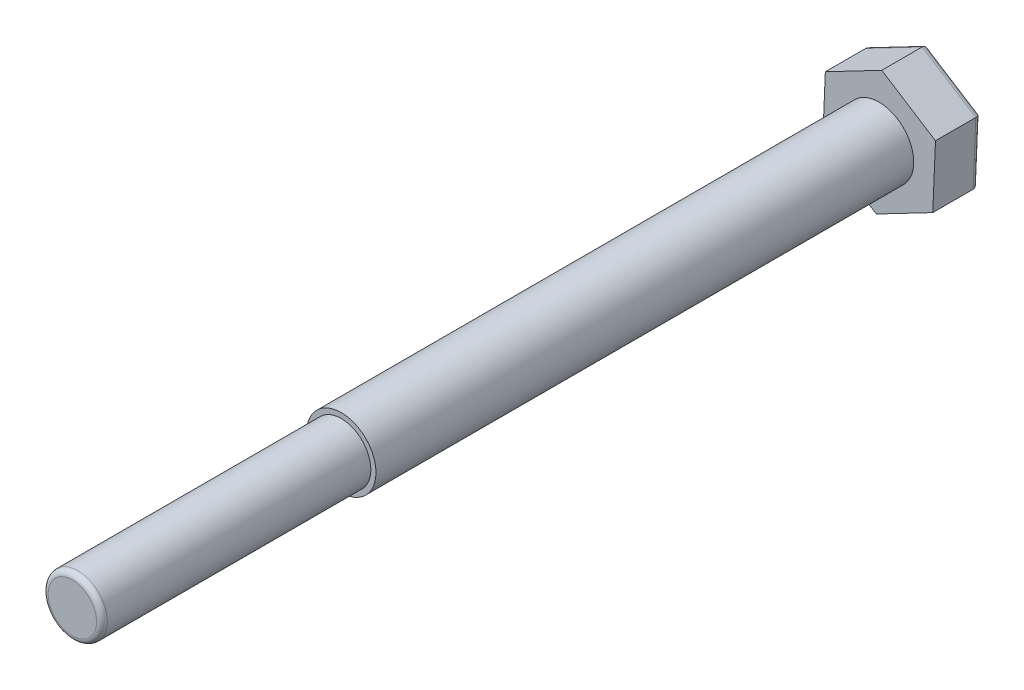
ISO-10303-21;
HEADER;
FILE_DESCRIPTION(('STEP AP214'),'2;1');
FILE_NAME('part.step','',(''),(''),'','','');
FILE_SCHEMA(('AUTOMOTIVE_DESIGN { 1 0 10303 214 1 1 1 1 }'));
ENDSEC;
DATA;
#1=APPLICATION_CONTEXT('core data for automotive mechanical design processes');
#2=APPLICATION_PROTOCOL_DEFINITION('international standard','automotive_design',2000,#1);
#3=PRODUCT_CONTEXT('',#1,'mechanical');
#4=PRODUCT('Part','Part','',(#3));
#5=PRODUCT_RELATED_PRODUCT_CATEGORY('part','',(#4));
#6=PRODUCT_DEFINITION_FORMATION('','',#4);
#7=PRODUCT_DEFINITION_CONTEXT('part definition',#1,'design');
#8=PRODUCT_DEFINITION('design','',#6,#7);
#9=PRODUCT_DEFINITION_SHAPE('','',#8);
#10=(LENGTH_UNIT() NAMED_UNIT(*) SI_UNIT(.MILLI.,.METRE.));
#11=(NAMED_UNIT(*) PLANE_ANGLE_UNIT() SI_UNIT($,.RADIAN.));
#12=(NAMED_UNIT(*) SI_UNIT($,.STERADIAN.) SOLID_ANGLE_UNIT());
#13=UNCERTAINTY_MEASURE_WITH_UNIT(LENGTH_MEASURE(1.E-05),#10,'distance_accuracy_value','');
#14=(GEOMETRIC_REPRESENTATION_CONTEXT(3) GLOBAL_UNCERTAINTY_ASSIGNED_CONTEXT((#13)) GLOBAL_UNIT_ASSIGNED_CONTEXT((#10,
#11,#12)) REPRESENTATION_CONTEXT('',''));
#15=CARTESIAN_POINT('',(0.,0.,0.));
#16=DIRECTION('',(0.,0.,1.));
#17=DIRECTION('',(1.,0.,0.));
#18=AXIS2_PLACEMENT_3D('',#15,#16,#17);
#19=CARTESIAN_POINT('',(0.,0.,217.));
#20=DIRECTION('',(0.,0.,1.));
#21=DIRECTION('',(1.,0.,0.));
#22=AXIS2_PLACEMENT_3D('',#19,#20,#21);
#23=PLANE('',#22);
#24=CARTESIAN_POINT('',(0.,0.,217.));
#25=DIRECTION('',(0.,0.,1.));
#26=DIRECTION('',(1.,0.,0.));
#27=AXIS2_PLACEMENT_3D('',#24,#25,#26);
#28=CIRCLE('',#27,12.9);
#29=CARTESIAN_POINT('',(12.9,0.,217.));
#30=VERTEX_POINT('',#29);
#31=EDGE_CURVE('E131',#30,#30,#28,.T.);
#32=ORIENTED_EDGE('',*,*,#31,.T.);
#33=EDGE_LOOP('',(#32));
#34=FACE_BOUND('',#33,.T.);
#35=CARTESIAN_POINT('',(0.,0.,217.));
#36=DIRECTION('',(0.,0.,1.));
#37=DIRECTION('',(1.,0.,0.));
#38=AXIS2_PLACEMENT_3D('',#35,#36,#37);
#39=CIRCLE('',#38,11.);
#40=CARTESIAN_POINT('',(11.,0.,217.));
#41=VERTEX_POINT('',#40);
#42=EDGE_CURVE('E169',#41,#41,#39,.T.);
#43=ORIENTED_EDGE('',*,*,#42,.F.);
#44=EDGE_LOOP('',(#43));
#45=FACE_BOUND('',#44,.T.);
#46=ADVANCED_FACE('F37',(#34,#45),#23,.T.);
#47=CARTESIAN_POINT('',(18.9733976863162,-36.3457037383633,17.));
#48=DIRECTION('',(0.,0.,-1.));
#49=DIRECTION('',(-1.,0.,0.));
#50=AXIS2_PLACEMENT_3D('',#47,#48,#49);
#51=PLANE('',#50);
#52=DIRECTION('',(0.0424733530909036,0.999097599975706,0.));
#53=VECTOR('',#52,1.);
#54=CARTESIAN_POINT('',(19.9787997617734,-12.6957037383635,17.));
#55=LINE('',#54,#53);
#56=CARTESIAN_POINT('',(19.9787997617734,-12.6957037383635,17.));
#57=VERTEX_POINT('',#56);
#58=CARTESIAN_POINT('',(20.9842018372306,10.9542962616365,17.));
#59=VERTEX_POINT('',#58);
#60=EDGE_CURVE('E123',#57,#59,#55,.T.);
#61=ORIENTED_EDGE('',*,*,#60,.T.);
#62=DIRECTION('',(-0.844007225893572,0.536331802748482,0.));
#63=VECTOR('',#62,1.);
#64=CARTESIAN_POINT('',(20.9842018372306,10.9542962616365,17.));
#65=LINE('',#64,#63);
#66=CARTESIAN_POINT('',(1.0054020754572,23.65,17.));
#67=VERTEX_POINT('',#66);
#68=EDGE_CURVE('E111',#59,#67,#65,.T.);
#69=ORIENTED_EDGE('',*,*,#68,.T.);
#70=DIRECTION('',(-0.886480578984472,-0.462765797227231,0.));
#71=VECTOR('',#70,1.);
#72=CARTESIAN_POINT('',(1.0054020754572,23.65,17.));
#73=LINE('',#72,#71);
#74=CARTESIAN_POINT('',(-19.9787997617736,12.6957037383632,17.));
#75=VERTEX_POINT('',#74);
#76=EDGE_CURVE('E122',#67,#75,#73,.T.);
#77=ORIENTED_EDGE('',*,*,#76,.T.);
#78=DIRECTION('',(-0.0424733530908878,-0.999097599975706,0.));
#79=VECTOR('',#78,1.);
#80=CARTESIAN_POINT('',(-19.9787997617736,12.6957037383632,17.));
#81=LINE('',#80,#79);
#82=CARTESIAN_POINT('',(-20.9842018372304,-10.9542962616368,17.));
#83=VERTEX_POINT('',#82);
#84=EDGE_CURVE('E273',#75,#83,#81,.T.);
#85=ORIENTED_EDGE('',*,*,#84,.T.);
#86=DIRECTION('',(0.844007225893576,-0.536331802748476,0.));
#87=VECTOR('',#86,1.);
#88=CARTESIAN_POINT('',(-20.9842018372304,-10.9542962616368,17.));
#89=LINE('',#88,#87);
#90=CARTESIAN_POINT('',(-1.00540207545719,-23.65,17.));
#91=VERTEX_POINT('',#90);
#92=EDGE_CURVE('E275',#83,#91,#89,.T.);
#93=ORIENTED_EDGE('',*,*,#92,.T.);
#94=DIRECTION('',(0.886480578984476,0.462765797227224,0.));
#95=VECTOR('',#94,1.);
#96=CARTESIAN_POINT('',(-1.00540207545719,-23.65,17.));
#97=LINE('',#96,#95);
#98=EDGE_CURVE('E129',#91,#57,#97,.T.);
#99=ORIENTED_EDGE('',*,*,#98,.T.);
#100=EDGE_LOOP('',(#61,#69,#77,#85,#93,#99));
#101=FACE_BOUND('',#100,.T.);
#102=CARTESIAN_POINT('',(0.,0.,17.));
#103=DIRECTION('',(0.,0.,-1.));
#104=DIRECTION('',(-1.,0.,0.));
#105=AXIS2_PLACEMENT_3D('',#102,#103,#104);
#106=CIRCLE('',#105,12.9);
#107=CARTESIAN_POINT('',(-12.9,0.,17.));
#108=VERTEX_POINT('',#107);
#109=EDGE_CURVE('E136',#108,#108,#106,.F.);
#110=ORIENTED_EDGE('',*,*,#109,.F.);
#111=EDGE_LOOP('',(#110));
#112=FACE_BOUND('',#111,.T.);
#113=ADVANCED_FACE('F126',(#101,#112),#51,.F.);
#114=CARTESIAN_POINT('',(19.9787997617734,-12.6957037383635,17.));
#115=DIRECTION('',(-0.999097599975706,0.0424733530909036,0.));
#116=DIRECTION('',(-0.0424733530909036,-0.999097599975706,0.));
#117=AXIS2_PLACEMENT_3D('',#114,#115,#116);
#118=PLANE('',#117);
#119=DIRECTION('',(0.,0.,-1.));
#120=VECTOR('',#119,1.);
#121=CARTESIAN_POINT('',(19.9787997617734,-12.6957037383635,17.));
#122=LINE('',#121,#120);
#123=CARTESIAN_POINT('',(19.9787997617734,-12.6957037383635,2.));
#124=VERTEX_POINT('',#123);
#125=EDGE_CURVE('E280',#57,#124,#122,.T.);
#126=ORIENTED_EDGE('',*,*,#125,.T.);
#127=DIRECTION('',(0.0424733530909036,0.999097599975706,0.));
#128=VECTOR('',#127,1.);
#129=CARTESIAN_POINT('',(20.9842018372306,10.9542962616365,2.));
#130=LINE('',#129,#128);
#131=CARTESIAN_POINT('',(20.9842018372306,10.9542962616365,2.));
#132=VERTEX_POINT('',#131);
#133=EDGE_CURVE('E135',#124,#132,#130,.T.);
#134=ORIENTED_EDGE('',*,*,#133,.T.);
#135=DIRECTION('',(0.,0.,-1.));
#136=VECTOR('',#135,1.);
#137=CARTESIAN_POINT('',(20.9842018372306,10.9542962616365,17.));
#138=LINE('',#137,#136);
#139=EDGE_CURVE('E116',#59,#132,#138,.T.);
#140=ORIENTED_EDGE('',*,*,#139,.F.);
#141=ORIENTED_EDGE('',*,*,#60,.F.);
#142=EDGE_LOOP('',(#126,#134,#140,#141));
#143=FACE_BOUND('',#142,.T.);
#144=ADVANCED_FACE('F133',(#143),#118,.F.);
#145=CARTESIAN_POINT('',(20.9842018372306,10.9542962616365,17.));
#146=DIRECTION('',(-0.536331802748482,-0.844007225893572,0.));
#147=DIRECTION('',(0.844007225893572,-0.536331802748482,0.));
#148=AXIS2_PLACEMENT_3D('',#145,#146,#147);
#149=PLANE('',#148);
#150=ORIENTED_EDGE('',*,*,#139,.T.);
#151=DIRECTION('',(-0.844007225893572,0.536331802748482,0.));
#152=VECTOR('',#151,1.);
#153=CARTESIAN_POINT('',(1.00540207545719,23.65,2.));
#154=LINE('',#153,#152);
#155=CARTESIAN_POINT('',(1.0054020754572,23.65,2.));
#156=VERTEX_POINT('',#155);
#157=EDGE_CURVE('E139',#132,#156,#154,.T.);
#158=ORIENTED_EDGE('',*,*,#157,.T.);
#159=DIRECTION('',(0.,0.,-1.));
#160=VECTOR('',#159,1.);
#161=CARTESIAN_POINT('',(1.0054020754572,23.65,17.));
#162=LINE('',#161,#160);
#163=EDGE_CURVE('E119',#67,#156,#162,.T.);
#164=ORIENTED_EDGE('',*,*,#163,.F.);
#165=ORIENTED_EDGE('',*,*,#68,.F.);
#166=EDGE_LOOP('',(#150,#158,#164,#165));
#167=FACE_BOUND('',#166,.T.);
#168=ADVANCED_FACE('F113',(#167),#149,.F.);
#169=CARTESIAN_POINT('',(1.0054020754572,23.65,17.));
#170=DIRECTION('',(0.462765797227231,-0.886480578984472,0.));
#171=DIRECTION('',(0.886480578984472,0.462765797227231,0.));
#172=AXIS2_PLACEMENT_3D('',#169,#170,#171);
#173=PLANE('',#172);
#174=ORIENTED_EDGE('',*,*,#163,.T.);
#175=DIRECTION('',(-0.886480578984472,-0.462765797227231,0.));
#176=VECTOR('',#175,1.);
#177=CARTESIAN_POINT('',(-19.9787997617736,12.6957037383632,2.));
#178=LINE('',#177,#176);
#179=CARTESIAN_POINT('',(-19.9787997617736,12.6957037383632,2.));
#180=VERTEX_POINT('',#179);
#181=EDGE_CURVE('E159',#156,#180,#178,.T.);
#182=ORIENTED_EDGE('',*,*,#181,.T.);
#183=DIRECTION('',(0.,0.,-1.));
#184=VECTOR('',#183,1.);
#185=CARTESIAN_POINT('',(-19.9787997617736,12.6957037383632,17.));
#186=LINE('',#185,#184);
#187=EDGE_CURVE('E141',#75,#180,#186,.T.);
#188=ORIENTED_EDGE('',*,*,#187,.F.);
#189=ORIENTED_EDGE('',*,*,#76,.F.);
#190=EDGE_LOOP('',(#174,#182,#188,#189));
#191=FACE_BOUND('',#190,.T.);
#192=ADVANCED_FACE('F224',(#191),#173,.F.);
#193=CARTESIAN_POINT('',(-19.9787997617736,12.6957037383632,17.));
#194=DIRECTION('',(0.999097599975706,-0.0424733530908878,0.));
#195=DIRECTION('',(0.0424733530908878,0.999097599975707,0.));
#196=AXIS2_PLACEMENT_3D('',#193,#194,#195);
#197=PLANE('',#196);
#198=ORIENTED_EDGE('',*,*,#187,.T.);
#199=DIRECTION('',(-0.0424733530908878,-0.999097599975707,0.));
#200=VECTOR('',#199,1.);
#201=CARTESIAN_POINT('',(-20.9842018372304,-10.9542962616368,2.));
#202=LINE('',#201,#200);
#203=CARTESIAN_POINT('',(-20.9842018372304,-10.9542962616368,2.));
#204=VERTEX_POINT('',#203);
#205=EDGE_CURVE('E161',#180,#204,#202,.T.);
#206=ORIENTED_EDGE('',*,*,#205,.T.);
#207=DIRECTION('',(0.,0.,-1.));
#208=VECTOR('',#207,1.);
#209=CARTESIAN_POINT('',(-20.9842018372304,-10.9542962616368,17.));
#210=LINE('',#209,#208);
#211=EDGE_CURVE('E284',#83,#204,#210,.T.);
#212=ORIENTED_EDGE('',*,*,#211,.F.);
#213=ORIENTED_EDGE('',*,*,#84,.F.);
#214=EDGE_LOOP('',(#198,#206,#212,#213));
#215=FACE_BOUND('',#214,.T.);
#216=ADVANCED_FACE('F221',(#215),#197,.F.);
#217=CARTESIAN_POINT('',(-20.9842018372304,-10.9542962616368,17.));
#218=DIRECTION('',(0.536331802748476,0.844007225893576,0.));
#219=DIRECTION('',(-0.844007225893576,0.536331802748476,0.));
#220=AXIS2_PLACEMENT_3D('',#217,#218,#219);
#221=PLANE('',#220);
#222=ORIENTED_EDGE('',*,*,#211,.T.);
#223=DIRECTION('',(0.844007225893576,-0.536331802748476,0.));
#224=VECTOR('',#223,1.);
#225=CARTESIAN_POINT('',(-1.00540207545719,-23.65,2.));
#226=LINE('',#225,#224);
#227=CARTESIAN_POINT('',(-1.00540207545719,-23.65,2.));
#228=VERTEX_POINT('',#227);
#229=EDGE_CURVE('E60',#204,#228,#226,.T.);
#230=ORIENTED_EDGE('',*,*,#229,.T.);
#231=DIRECTION('',(0.,0.,-1.));
#232=VECTOR('',#231,1.);
#233=CARTESIAN_POINT('',(-1.00540207545719,-23.65,17.));
#234=LINE('',#233,#232);
#235=EDGE_CURVE('E282',#91,#228,#234,.T.);
#236=ORIENTED_EDGE('',*,*,#235,.F.);
#237=ORIENTED_EDGE('',*,*,#92,.F.);
#238=EDGE_LOOP('',(#222,#230,#236,#237));
#239=FACE_BOUND('',#238,.T.);
#240=ADVANCED_FACE('F218',(#239),#221,.F.);
#241=CARTESIAN_POINT('',(-1.00540207545719,-23.65,17.));
#242=DIRECTION('',(-0.462765797227224,0.886480578984476,0.));
#243=DIRECTION('',(-0.886480578984476,-0.462765797227224,0.));
#244=AXIS2_PLACEMENT_3D('',#241,#242,#243);
#245=PLANE('',#244);
#246=ORIENTED_EDGE('',*,*,#235,.T.);
#247=DIRECTION('',(0.886480578984476,0.462765797227224,0.));
#248=VECTOR('',#247,1.);
#249=CARTESIAN_POINT('',(19.9787997617734,-12.6957037383635,2.));
#250=LINE('',#249,#248);
#251=EDGE_CURVE('E52',#228,#124,#250,.T.);
#252=ORIENTED_EDGE('',*,*,#251,.T.);
#253=ORIENTED_EDGE('',*,*,#125,.F.);
#254=ORIENTED_EDGE('',*,*,#98,.F.);
#255=EDGE_LOOP('',(#246,#252,#253,#254));
#256=FACE_BOUND('',#255,.T.);
#257=ADVANCED_FACE('F214',(#256),#245,.F.);
#258=CARTESIAN_POINT('',(18.9733976863162,-36.3457037383633,0.));
#259=DIRECTION('',(0.,0.,-1.));
#260=DIRECTION('',(-1.,0.,0.));
#261=AXIS2_PLACEMENT_3D('',#258,#259,#260);
#262=PLANE('',#261);
#263=DIRECTION('',(-0.886480578984472,-0.462765797227231,0.));
#264=VECTOR('',#263,1.);
#265=CARTESIAN_POINT('',(1.93093366991166,21.8770388420311,0.));
#266=LINE('',#265,#264);
#267=CARTESIAN_POINT('',(-18.029648565503,11.4570984955961,0.));
#268=VERTEX_POINT('',#267);
#269=CARTESIAN_POINT('',(0.907314068095531,21.3426829268293,0.));
#270=VERTEX_POINT('',#269);
#271=EDGE_CURVE('E154',#268,#270,#266,.F.);
#272=ORIENTED_EDGE('',*,*,#271,.T.);
#273=DIRECTION('',(-0.844007225893572,0.536331802748482,0.));
#274=VECTOR('',#273,1.);
#275=CARTESIAN_POINT('',(19.9115382317336,9.26628180984933,0.));
#276=LINE('',#275,#274);
#277=CARTESIAN_POINT('',(18.9369626335983,9.88558443123292,0.));
#278=VERTEX_POINT('',#277);
#279=EDGE_CURVE('E156',#270,#278,#276,.F.);
#280=ORIENTED_EDGE('',*,*,#279,.T.);
#281=DIRECTION('',(0.0424733530909036,0.999097599975706,0.));
#282=VECTOR('',#281,1.);
#283=CARTESIAN_POINT('',(17.980604561822,-12.6107570321817,0.));
#284=LINE('',#283,#282);
#285=CARTESIAN_POINT('',(18.0296485655028,-11.4570984955964,0.));
#286=VERTEX_POINT('',#285);
#287=EDGE_CURVE('E146',#278,#286,#284,.F.);
#288=ORIENTED_EDGE('',*,*,#287,.T.);
#289=DIRECTION('',(0.886480578984476,0.462765797227224,0.));
#290=VECTOR('',#289,1.);
#291=CARTESIAN_POINT('',(-1.93093366991164,-21.877038842031,0.));
#292=LINE('',#291,#290);
#293=CARTESIAN_POINT('',(-0.90731406809552,-21.3426829268293,0.));
#294=VERTEX_POINT('',#293);
#295=EDGE_CURVE('E148',#286,#294,#292,.F.);
#296=ORIENTED_EDGE('',*,*,#295,.T.);
#297=DIRECTION('',(0.844007225893576,-0.536331802748476,0.));
#298=VECTOR('',#297,1.);
#299=CARTESIAN_POINT('',(-19.9115382317334,-9.26628180984964,0.));
#300=LINE('',#299,#298);
#301=CARTESIAN_POINT('',(-18.9369626335981,-9.88558443123322,0.));
#302=VERTEX_POINT('',#301);
#303=EDGE_CURVE('E150',#294,#302,#300,.F.);
#304=ORIENTED_EDGE('',*,*,#303,.T.);
#305=DIRECTION('',(-0.0424733530908878,-0.999097599975707,0.));
#306=VECTOR('',#305,1.);
#307=CARTESIAN_POINT('',(-17.9806045618221,12.6107570321814,0.));
#308=LINE('',#307,#306);
#309=EDGE_CURVE('E152',#302,#268,#308,.F.);
#310=ORIENTED_EDGE('',*,*,#309,.T.);
#311=EDGE_LOOP('',(#272,#280,#288,#296,#304,#310));
#312=FACE_BOUND('',#311,.T.);
#313=ADVANCED_FACE('F209',(#312),#262,.T.);
#314=CARTESIAN_POINT('',(0.,0.,217.));
#315=DIRECTION('',(0.,0.,-1.));
#316=DIRECTION('',(-1.,0.,0.));
#317=AXIS2_PLACEMENT_3D('',#314,#315,#316);
#318=CYLINDRICAL_SURFACE('',#317,12.9);
#319=ORIENTED_EDGE('',*,*,#31,.F.);
#320=EDGE_LOOP('',(#319));
#321=FACE_BOUND('',#320,.T.);
#322=ORIENTED_EDGE('',*,*,#109,.T.);
#323=EDGE_LOOP('',(#322));
#324=FACE_BOUND('',#323,.T.);
#325=ADVANCED_FACE('F206',(#321,#324),#318,.T.);
#326=CARTESIAN_POINT('',(-19.9115382317334,-9.26628180984964,2.));
#327=DIRECTION('',(-0.844007225893576,0.536331802748476,0.));
#328=DIRECTION('',(-0.536331802748476,-0.844007225893576,0.));
#329=AXIS2_PLACEMENT_3D('',#326,#327,#328);
#330=CYLINDRICAL_SURFACE('',#329,2.);
#331=CARTESIAN_POINT('',(-18.9369626335981,-9.88558443123322,2.));
#332=DIRECTION('',(-0.462765797227234,0.886480578984471,0.));
#333=DIRECTION('',(-0.886480578984471,-0.462765797227234,0.));
#334=AXIS2_PLACEMENT_3D('',#331,#332,#333);
#335=ELLIPSE('',#334,2.3094010767585,2.);
#336=EDGE_CURVE('E177',#302,#204,#335,.T.);
#337=ORIENTED_EDGE('',*,*,#336,.F.);
#338=ORIENTED_EDGE('',*,*,#303,.F.);
#339=CARTESIAN_POINT('',(-0.90731406809552,-21.3426829268293,2.));
#340=DIRECTION('',(-0.999097599975706,0.0424733530909003,0.));
#341=DIRECTION('',(-0.0424733530909002,-0.999097599975706,0.));
#342=AXIS2_PLACEMENT_3D('',#339,#340,#341);
#343=ELLIPSE('',#342,2.3094010767585,2.);
#344=EDGE_CURVE('E180',#228,#294,#343,.F.);
#345=ORIENTED_EDGE('',*,*,#344,.F.);
#346=ORIENTED_EDGE('',*,*,#229,.F.);
#347=EDGE_LOOP('',(#337,#338,#345,#346));
#348=FACE_BOUND('',#347,.T.);
#349=ADVANCED_FACE('F208',(#348),#330,.T.);
#350=CARTESIAN_POINT('',(-1.93093366991164,-21.877038842031,2.));
#351=DIRECTION('',(-0.886480578984476,-0.462765797227224,0.));
#352=DIRECTION('',(0.462765797227224,-0.886480578984476,0.));
#353=AXIS2_PLACEMENT_3D('',#350,#351,#352);
#354=CYLINDRICAL_SURFACE('',#353,2.);
#355=ORIENTED_EDGE('',*,*,#344,.T.);
#356=ORIENTED_EDGE('',*,*,#295,.F.);
#357=CARTESIAN_POINT('',(18.0296485655028,-11.4570984955964,2.));
#358=DIRECTION('',(-0.536331802748482,-0.844007225893572,0.));
#359=DIRECTION('',(0.844007225893572,-0.536331802748482,0.));
#360=AXIS2_PLACEMENT_3D('',#357,#358,#359);
#361=ELLIPSE('',#360,2.3094010767585,2.);
#362=EDGE_CURVE('E174',#124,#286,#361,.F.);
#363=ORIENTED_EDGE('',*,*,#362,.F.);
#364=ORIENTED_EDGE('',*,*,#251,.F.);
#365=EDGE_LOOP('',(#355,#356,#363,#364));
#366=FACE_BOUND('',#365,.T.);
#367=ADVANCED_FACE('F248',(#366),#354,.T.);
#368=CARTESIAN_POINT('',(-17.9806045618221,12.6107570321814,2.));
#369=DIRECTION('',(0.0424733530908878,0.999097599975707,0.));
#370=DIRECTION('',(-0.999097599975707,0.0424733530908878,0.));
#371=AXIS2_PLACEMENT_3D('',#368,#369,#370);
#372=CYLINDRICAL_SURFACE('',#371,2.);
#373=ORIENTED_EDGE('',*,*,#336,.T.);
#374=ORIENTED_EDGE('',*,*,#205,.F.);
#375=CARTESIAN_POINT('',(-18.029648565503,11.457098495596,2.));
#376=DIRECTION('',(0.536331802748472,0.844007225893579,0.));
#377=DIRECTION('',(-0.844007225893579,0.536331802748472,0.));
#378=AXIS2_PLACEMENT_3D('',#375,#376,#377);
#379=ELLIPSE('',#378,2.30940107675851,2.);
#380=EDGE_CURVE('E171',#268,#180,#379,.T.);
#381=ORIENTED_EDGE('',*,*,#380,.F.);
#382=ORIENTED_EDGE('',*,*,#309,.F.);
#383=EDGE_LOOP('',(#373,#374,#381,#382));
#384=FACE_BOUND('',#383,.T.);
#385=ADVANCED_FACE('F244',(#384),#372,.T.);
#386=CARTESIAN_POINT('',(17.980604561822,-12.6107570321817,2.));
#387=DIRECTION('',(-0.0424733530909036,-0.999097599975706,0.));
#388=DIRECTION('',(0.999097599975706,-0.0424733530909036,0.));
#389=AXIS2_PLACEMENT_3D('',#386,#387,#388);
#390=CYLINDRICAL_SURFACE('',#389,2.);
#391=ORIENTED_EDGE('',*,*,#362,.T.);
#392=ORIENTED_EDGE('',*,*,#287,.F.);
#393=CARTESIAN_POINT('',(18.9369626335983,9.88558443123291,2.));
#394=DIRECTION('',(0.462765797227224,-0.886480578984476,0.));
#395=DIRECTION('',(-0.886480578984476,-0.462765797227224,0.));
#396=AXIS2_PLACEMENT_3D('',#393,#394,#395);
#397=ELLIPSE('',#396,2.3094010767585,2.);
#398=EDGE_CURVE('E168',#132,#278,#397,.F.);
#399=ORIENTED_EDGE('',*,*,#398,.F.);
#400=ORIENTED_EDGE('',*,*,#133,.F.);
#401=EDGE_LOOP('',(#391,#392,#399,#400));
#402=FACE_BOUND('',#401,.T.);
#403=ADVANCED_FACE('F240',(#402),#390,.T.);
#404=CARTESIAN_POINT('',(1.93093366991166,21.8770388420311,2.));
#405=DIRECTION('',(0.886480578984472,0.462765797227231,0.));
#406=DIRECTION('',(-0.462765797227231,0.886480578984472,0.));
#407=AXIS2_PLACEMENT_3D('',#404,#405,#406);
#408=CYLINDRICAL_SURFACE('',#407,2.);
#409=ORIENTED_EDGE('',*,*,#380,.T.);
#410=ORIENTED_EDGE('',*,*,#181,.F.);
#411=CARTESIAN_POINT('',(0.907314068095525,21.3426829268293,2.));
#412=DIRECTION('',(0.999097599975706,-0.0424733530908997,0.));
#413=DIRECTION('',(0.0424733530908995,0.999097599975706,0.));
#414=AXIS2_PLACEMENT_3D('',#411,#412,#413);
#415=ELLIPSE('',#414,2.30940107675851,2.);
#416=EDGE_CURVE('E166',#270,#156,#415,.T.);
#417=ORIENTED_EDGE('',*,*,#416,.F.);
#418=ORIENTED_EDGE('',*,*,#271,.F.);
#419=EDGE_LOOP('',(#409,#410,#417,#418));
#420=FACE_BOUND('',#419,.T.);
#421=ADVANCED_FACE('F236',(#420),#408,.T.);
#422=CARTESIAN_POINT('',(19.9115382317336,9.26628180984933,2.));
#423=DIRECTION('',(0.844007225893572,-0.536331802748482,0.));
#424=DIRECTION('',(0.536331802748482,0.844007225893572,0.));
#425=AXIS2_PLACEMENT_3D('',#422,#423,#424);
#426=CYLINDRICAL_SURFACE('',#425,2.);
#427=ORIENTED_EDGE('',*,*,#398,.T.);
#428=ORIENTED_EDGE('',*,*,#279,.F.);
#429=ORIENTED_EDGE('',*,*,#416,.T.);
#430=ORIENTED_EDGE('',*,*,#157,.F.);
#431=EDGE_LOOP('',(#427,#428,#429,#430));
#432=FACE_BOUND('',#431,.T.);
#433=ADVANCED_FACE('F233',(#432),#426,.T.);
#434=CARTESIAN_POINT('',(0.,0.,317.));
#435=DIRECTION('',(0.,0.,-1.));
#436=DIRECTION('',(-1.,0.,0.));
#437=AXIS2_PLACEMENT_3D('',#434,#435,#436);
#438=CYLINDRICAL_SURFACE('',#437,11.);
#439=CARTESIAN_POINT('',(0.,0.,315.));
#440=DIRECTION('',(0.,0.,1.));
#441=DIRECTION('',(1.,0.,0.));
#442=AXIS2_PLACEMENT_3D('',#439,#440,#441);
#443=CIRCLE('',#442,11.);
#444=CARTESIAN_POINT('',(11.,0.,315.));
#445=VERTEX_POINT('',#444);
#446=EDGE_CURVE('E11',#445,#445,#443,.F.);
#447=ORIENTED_EDGE('',*,*,#446,.T.);
#448=EDGE_LOOP('',(#447));
#449=FACE_BOUND('',#448,.T.);
#450=ORIENTED_EDGE('',*,*,#42,.T.);
#451=EDGE_LOOP('',(#450));
#452=FACE_BOUND('',#451,.T.);
#453=ADVANCED_FACE('F192',(#449,#452),#438,.T.);
#454=CARTESIAN_POINT('',(0.,0.,317.));
#455=DIRECTION('',(0.,0.,1.));
#456=DIRECTION('',(1.,0.,0.));
#457=AXIS2_PLACEMENT_3D('',#454,#455,#456);
#458=PLANE('',#457);
#459=CARTESIAN_POINT('',(0.,0.,317.));
#460=DIRECTION('',(0.,0.,1.));
#461=DIRECTION('',(1.,0.,0.));
#462=AXIS2_PLACEMENT_3D('',#459,#460,#461);
#463=CIRCLE('',#462,9.);
#464=CARTESIAN_POINT('',(9.,0.,317.));
#465=VERTEX_POINT('',#464);
#466=EDGE_CURVE('E45',#465,#465,#463,.T.);
#467=ORIENTED_EDGE('',*,*,#466,.T.);
#468=EDGE_LOOP('',(#467));
#469=FACE_BOUND('',#468,.T.);
#470=ADVANCED_FACE('F185',(#469),#458,.T.);
#471=CARTESIAN_POINT('',(0.,0.,315.));
#472=DIRECTION('',(0.,0.,1.));
#473=DIRECTION('',(1.,0.,0.));
#474=AXIS2_PLACEMENT_3D('',#471,#472,#473);
#475=TOROIDAL_SURFACE('',#474,9.,2.);
#476=ORIENTED_EDGE('',*,*,#446,.F.);
#477=EDGE_LOOP('',(#476));
#478=FACE_BOUND('',#477,.T.);
#479=ORIENTED_EDGE('',*,*,#466,.F.);
#480=EDGE_LOOP('',(#479));
#481=FACE_BOUND('',#480,.T.);
#482=ADVANCED_FACE('F39',(#478,#481),#475,.T.);
#483=CLOSED_SHELL('',(#46,#113,#144,#168,#192,#216,#240,#257,#313,#325,#349,#367,#385,#403,#421,
#433,#453,#470,#482));
#484=MANIFOLD_SOLID_BREP('B2',#483);
#485=ADVANCED_BREP_SHAPE_REPRESENTATION('',(#18,#484),#14);
#486=SHAPE_DEFINITION_REPRESENTATION(#9,#485);
ENDSEC;
END-ISO-10303-21;
